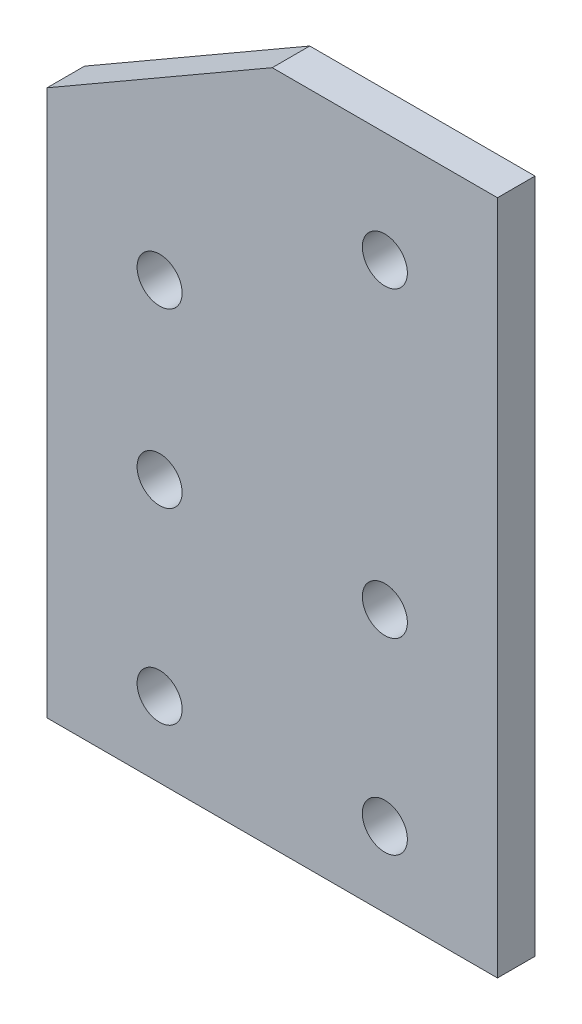
ISO-10303-21;
HEADER;
FILE_DESCRIPTION(('STEP AP214'),'2;1');
FILE_NAME('part.step','',(''),(''),'','','');
FILE_SCHEMA(('AUTOMOTIVE_DESIGN { 1 0 10303 214 1 1 1 1 }'));
ENDSEC;
DATA;
#1=APPLICATION_CONTEXT('core data for automotive mechanical design processes');
#2=APPLICATION_PROTOCOL_DEFINITION('international standard','automotive_design',2000,#1);
#3=PRODUCT_CONTEXT('',#1,'mechanical');
#4=PRODUCT('Part','Part','',(#3));
#5=PRODUCT_RELATED_PRODUCT_CATEGORY('part','',(#4));
#6=PRODUCT_DEFINITION_FORMATION('','',#4);
#7=PRODUCT_DEFINITION_CONTEXT('part definition',#1,'design');
#8=PRODUCT_DEFINITION('design','',#6,#7);
#9=PRODUCT_DEFINITION_SHAPE('','',#8);
#10=(LENGTH_UNIT() NAMED_UNIT(*) SI_UNIT(.MILLI.,.METRE.));
#11=(NAMED_UNIT(*) PLANE_ANGLE_UNIT() SI_UNIT($,.RADIAN.));
#12=(NAMED_UNIT(*) SI_UNIT($,.STERADIAN.) SOLID_ANGLE_UNIT());
#13=UNCERTAINTY_MEASURE_WITH_UNIT(LENGTH_MEASURE(1.E-05),#10,'distance_accuracy_value','');
#14=(GEOMETRIC_REPRESENTATION_CONTEXT(3) GLOBAL_UNCERTAINTY_ASSIGNED_CONTEXT((#13)) GLOBAL_UNIT_ASSIGNED_CONTEXT((#10,
#11,#12)) REPRESENTATION_CONTEXT('',''));
#15=CARTESIAN_POINT('',(0.,0.,0.));
#16=DIRECTION('',(0.,0.,1.));
#17=DIRECTION('',(1.,0.,0.));
#18=AXIS2_PLACEMENT_3D('',#15,#16,#17);
#19=CARTESIAN_POINT('',(0.,0.,6.35));
#20=DIRECTION('',(0.,0.,-1.));
#21=DIRECTION('',(-1.,0.,0.));
#22=AXIS2_PLACEMENT_3D('',#19,#20,#21);
#23=PLANE('',#22);
#24=DIRECTION('',(0.,-1.,0.));
#25=VECTOR('',#24,1.);
#26=CARTESIAN_POINT('',(0.,0.,6.35));
#27=LINE('',#26,#25);
#28=CARTESIAN_POINT('',(0.,92.3029547438752,6.35));
#29=VERTEX_POINT('',#28);
#30=CARTESIAN_POINT('',(0.,0.,6.35));
#31=VERTEX_POINT('',#30);
#32=EDGE_CURVE('E147',#29,#31,#27,.T.);
#33=ORIENTED_EDGE('',*,*,#32,.T.);
#34=DIRECTION('',(1.,0.,0.));
#35=VECTOR('',#34,1.);
#36=CARTESIAN_POINT('',(0.,0.,6.35));
#37=LINE('',#36,#35);
#38=CARTESIAN_POINT('',(76.2,0.,6.35));
#39=VERTEX_POINT('',#38);
#40=EDGE_CURVE('E104',#31,#39,#37,.T.);
#41=ORIENTED_EDGE('',*,*,#40,.T.);
#42=DIRECTION('',(0.,1.,0.));
#43=VECTOR('',#42,1.);
#44=CARTESIAN_POINT('',(76.2,0.,6.35));
#45=LINE('',#44,#43);
#46=CARTESIAN_POINT('',(76.2,114.3,6.35));
#47=VERTEX_POINT('',#46);
#48=EDGE_CURVE('E108',#39,#47,#45,.T.);
#49=ORIENTED_EDGE('',*,*,#48,.T.);
#50=DIRECTION('',(-1.,0.,0.));
#51=VECTOR('',#50,1.);
#52=CARTESIAN_POINT('',(38.1,114.3,6.35));
#53=LINE('',#52,#51);
#54=CARTESIAN_POINT('',(38.1,114.3,6.35));
#55=VERTEX_POINT('',#54);
#56=EDGE_CURVE('E112',#47,#55,#53,.T.);
#57=ORIENTED_EDGE('',*,*,#56,.T.);
#58=DIRECTION('',(-0.866025403784438,-0.500000000000001,0.));
#59=VECTOR('',#58,1.);
#60=CARTESIAN_POINT('',(0.,92.3029547438752,6.35));
#61=LINE('',#60,#59);
#62=EDGE_CURVE('E70',#55,#29,#61,.T.);
#63=ORIENTED_EDGE('',*,*,#62,.T.);
#64=EDGE_LOOP('',(#33,#41,#49,#57,#63));
#65=FACE_BOUND('',#64,.T.);
#66=CARTESIAN_POINT('',(57.15,95.6570452561244,6.35));
#67=DIRECTION('',(0.,0.,1.));
#68=DIRECTION('',(1.,0.,0.));
#69=AXIS2_PLACEMENT_3D('',#66,#67,#68);
#70=CIRCLE('',#69,3.81);
#71=CARTESIAN_POINT('',(60.96,95.6570452561244,6.35));
#72=VERTEX_POINT('',#71);
#73=EDGE_CURVE('E138',#72,#72,#70,.T.);
#74=ORIENTED_EDGE('',*,*,#73,.F.);
#75=EDGE_LOOP('',(#74));
#76=FACE_BOUND('',#75,.T.);
#77=CARTESIAN_POINT('',(19.05,73.66,6.35));
#78=DIRECTION('',(0.,0.,1.));
#79=DIRECTION('',(1.,0.,0.));
#80=AXIS2_PLACEMENT_3D('',#77,#78,#79);
#81=CIRCLE('',#80,3.81);
#82=CARTESIAN_POINT('',(22.86,73.66,6.35));
#83=VERTEX_POINT('',#82);
#84=EDGE_CURVE('E239',#83,#83,#81,.T.);
#85=ORIENTED_EDGE('',*,*,#84,.F.);
#86=EDGE_LOOP('',(#85));
#87=FACE_BOUND('',#86,.T.);
#88=CARTESIAN_POINT('',(19.05,44.45,6.35));
#89=DIRECTION('',(0.,0.,1.));
#90=DIRECTION('',(1.,0.,0.));
#91=AXIS2_PLACEMENT_3D('',#88,#89,#90);
#92=CIRCLE('',#91,3.81);
#93=CARTESIAN_POINT('',(22.86,44.45,6.35));
#94=VERTEX_POINT('',#93);
#95=EDGE_CURVE('E231',#94,#94,#92,.T.);
#96=ORIENTED_EDGE('',*,*,#95,.F.);
#97=EDGE_LOOP('',(#96));
#98=FACE_BOUND('',#97,.T.);
#99=CARTESIAN_POINT('',(19.05,12.7,6.35));
#100=DIRECTION('',(0.,0.,1.));
#101=DIRECTION('',(1.,0.,0.));
#102=AXIS2_PLACEMENT_3D('',#99,#100,#101);
#103=CIRCLE('',#102,3.81);
#104=CARTESIAN_POINT('',(22.86,12.7,6.35));
#105=VERTEX_POINT('',#104);
#106=EDGE_CURVE('E223',#105,#105,#103,.T.);
#107=ORIENTED_EDGE('',*,*,#106,.F.);
#108=EDGE_LOOP('',(#107));
#109=FACE_BOUND('',#108,.T.);
#110=CARTESIAN_POINT('',(57.15,44.45,6.35));
#111=DIRECTION('',(0.,0.,1.));
#112=DIRECTION('',(1.,0.,0.));
#113=AXIS2_PLACEMENT_3D('',#110,#111,#112);
#114=CIRCLE('',#113,3.81);
#115=CARTESIAN_POINT('',(60.96,44.45,6.35));
#116=VERTEX_POINT('',#115);
#117=EDGE_CURVE('E215',#116,#116,#114,.T.);
#118=ORIENTED_EDGE('',*,*,#117,.F.);
#119=EDGE_LOOP('',(#118));
#120=FACE_BOUND('',#119,.T.);
#121=CARTESIAN_POINT('',(57.15,12.7,6.35));
#122=DIRECTION('',(0.,0.,1.));
#123=DIRECTION('',(1.,0.,0.));
#124=AXIS2_PLACEMENT_3D('',#121,#122,#123);
#125=CIRCLE('',#124,3.81);
#126=CARTESIAN_POINT('',(60.96,12.7,6.35));
#127=VERTEX_POINT('',#126);
#128=EDGE_CURVE('E203',#127,#127,#125,.T.);
#129=ORIENTED_EDGE('',*,*,#128,.F.);
#130=EDGE_LOOP('',(#129));
#131=FACE_BOUND('',#130,.T.);
#132=ADVANCED_FACE('F52',(#65,#76,#87,#98,#109,#120,#131),#23,.F.);
#133=CARTESIAN_POINT('',(0.,0.,0.));
#134=DIRECTION('',(0.,0.,-1.));
#135=DIRECTION('',(-1.,0.,0.));
#136=AXIS2_PLACEMENT_3D('',#133,#134,#135);
#137=PLANE('',#136);
#138=CARTESIAN_POINT('',(57.15,44.45,0.));
#139=DIRECTION('',(0.,0.,1.));
#140=DIRECTION('',(1.,0.,0.));
#141=AXIS2_PLACEMENT_3D('',#138,#139,#140);
#142=CIRCLE('',#141,3.81);
#143=CARTESIAN_POINT('',(60.96,44.45,0.));
#144=VERTEX_POINT('',#143);
#145=EDGE_CURVE('E212',#144,#144,#142,.T.);
#146=ORIENTED_EDGE('',*,*,#145,.T.);
#147=EDGE_LOOP('',(#146));
#148=FACE_BOUND('',#147,.T.);
#149=CARTESIAN_POINT('',(19.05,44.45,0.));
#150=DIRECTION('',(0.,0.,1.));
#151=DIRECTION('',(1.,0.,0.));
#152=AXIS2_PLACEMENT_3D('',#149,#150,#151);
#153=CIRCLE('',#152,3.81);
#154=CARTESIAN_POINT('',(22.86,44.45,0.));
#155=VERTEX_POINT('',#154);
#156=EDGE_CURVE('E227',#155,#155,#153,.T.);
#157=ORIENTED_EDGE('',*,*,#156,.T.);
#158=EDGE_LOOP('',(#157));
#159=FACE_BOUND('',#158,.T.);
#160=CARTESIAN_POINT('',(57.15,95.6570452561244,0.));
#161=DIRECTION('',(0.,0.,1.));
#162=DIRECTION('',(1.,0.,0.));
#163=AXIS2_PLACEMENT_3D('',#160,#161,#162);
#164=CIRCLE('',#163,3.81);
#165=CARTESIAN_POINT('',(60.96,95.6570452561244,0.));
#166=VERTEX_POINT('',#165);
#167=EDGE_CURVE('E243',#166,#166,#164,.T.);
#168=ORIENTED_EDGE('',*,*,#167,.T.);
#169=EDGE_LOOP('',(#168));
#170=FACE_BOUND('',#169,.T.);
#171=DIRECTION('',(0.,-1.,0.));
#172=VECTOR('',#171,1.);
#173=CARTESIAN_POINT('',(0.,0.,0.));
#174=LINE('',#173,#172);
#175=CARTESIAN_POINT('',(0.,92.3029547438752,0.));
#176=VERTEX_POINT('',#175);
#177=CARTESIAN_POINT('',(0.,0.,0.));
#178=VERTEX_POINT('',#177);
#179=EDGE_CURVE('E133',#176,#178,#174,.T.);
#180=ORIENTED_EDGE('',*,*,#179,.F.);
#181=DIRECTION('',(-0.866025403784438,-0.500000000000001,0.));
#182=VECTOR('',#181,1.);
#183=CARTESIAN_POINT('',(0.,92.3029547438752,0.));
#184=LINE('',#183,#182);
#185=CARTESIAN_POINT('',(38.1,114.3,0.));
#186=VERTEX_POINT('',#185);
#187=EDGE_CURVE('E96',#186,#176,#184,.T.);
#188=ORIENTED_EDGE('',*,*,#187,.F.);
#189=DIRECTION('',(-1.,0.,0.));
#190=VECTOR('',#189,1.);
#191=CARTESIAN_POINT('',(38.1,114.3,0.));
#192=LINE('',#191,#190);
#193=CARTESIAN_POINT('',(76.2,114.3,0.));
#194=VERTEX_POINT('',#193);
#195=EDGE_CURVE('E90',#194,#186,#192,.T.);
#196=ORIENTED_EDGE('',*,*,#195,.F.);
#197=DIRECTION('',(0.,1.,0.));
#198=VECTOR('',#197,1.);
#199=CARTESIAN_POINT('',(76.2,0.,0.));
#200=LINE('',#199,#198);
#201=CARTESIAN_POINT('',(76.2,0.,0.));
#202=VERTEX_POINT('',#201);
#203=EDGE_CURVE('E120',#202,#194,#200,.T.);
#204=ORIENTED_EDGE('',*,*,#203,.F.);
#205=DIRECTION('',(1.,0.,0.));
#206=VECTOR('',#205,1.);
#207=CARTESIAN_POINT('',(0.,0.,0.));
#208=LINE('',#207,#206);
#209=EDGE_CURVE('E137',#178,#202,#208,.T.);
#210=ORIENTED_EDGE('',*,*,#209,.F.);
#211=EDGE_LOOP('',(#180,#188,#196,#204,#210));
#212=FACE_BOUND('',#211,.T.);
#213=CARTESIAN_POINT('',(19.05,73.66,0.));
#214=DIRECTION('',(0.,0.,1.));
#215=DIRECTION('',(1.,0.,0.));
#216=AXIS2_PLACEMENT_3D('',#213,#214,#215);
#217=CIRCLE('',#216,3.81);
#218=CARTESIAN_POINT('',(22.86,73.66,0.));
#219=VERTEX_POINT('',#218);
#220=EDGE_CURVE('E235',#219,#219,#217,.T.);
#221=ORIENTED_EDGE('',*,*,#220,.T.);
#222=EDGE_LOOP('',(#221));
#223=FACE_BOUND('',#222,.T.);
#224=CARTESIAN_POINT('',(19.05,12.7,0.));
#225=DIRECTION('',(0.,0.,1.));
#226=DIRECTION('',(1.,0.,0.));
#227=AXIS2_PLACEMENT_3D('',#224,#225,#226);
#228=CIRCLE('',#227,3.81);
#229=CARTESIAN_POINT('',(22.86,12.7,0.));
#230=VERTEX_POINT('',#229);
#231=EDGE_CURVE('E219',#230,#230,#228,.T.);
#232=ORIENTED_EDGE('',*,*,#231,.T.);
#233=EDGE_LOOP('',(#232));
#234=FACE_BOUND('',#233,.T.);
#235=CARTESIAN_POINT('',(57.15,12.7,0.));
#236=DIRECTION('',(0.,0.,1.));
#237=DIRECTION('',(1.,0.,0.));
#238=AXIS2_PLACEMENT_3D('',#235,#236,#237);
#239=CIRCLE('',#238,3.81);
#240=CARTESIAN_POINT('',(60.96,12.7,0.));
#241=VERTEX_POINT('',#240);
#242=EDGE_CURVE('E206',#241,#241,#239,.T.);
#243=ORIENTED_EDGE('',*,*,#242,.T.);
#244=EDGE_LOOP('',(#243));
#245=FACE_BOUND('',#244,.T.);
#246=ADVANCED_FACE('F155',(#148,#159,#170,#212,#223,#234,#245),#137,.T.);
#247=CARTESIAN_POINT('',(0.,0.,6.35));
#248=DIRECTION('',(1.,0.,0.));
#249=DIRECTION('',(0.,0.,-1.));
#250=AXIS2_PLACEMENT_3D('',#247,#248,#249);
#251=PLANE('',#250);
#252=ORIENTED_EDGE('',*,*,#179,.T.);
#253=DIRECTION('',(0.,0.,-1.));
#254=VECTOR('',#253,1.);
#255=CARTESIAN_POINT('',(0.,0.,6.35));
#256=LINE('',#255,#254);
#257=EDGE_CURVE('E13',#31,#178,#256,.T.);
#258=ORIENTED_EDGE('',*,*,#257,.F.);
#259=ORIENTED_EDGE('',*,*,#32,.F.);
#260=DIRECTION('',(0.,0.,-1.));
#261=VECTOR('',#260,1.);
#262=CARTESIAN_POINT('',(0.,92.3029547438752,6.35));
#263=LINE('',#262,#261);
#264=EDGE_CURVE('E129',#29,#176,#263,.T.);
#265=ORIENTED_EDGE('',*,*,#264,.T.);
#266=EDGE_LOOP('',(#252,#258,#259,#265));
#267=FACE_BOUND('',#266,.T.);
#268=ADVANCED_FACE('F54',(#267),#251,.F.);
#269=CARTESIAN_POINT('',(0.,0.,6.35));
#270=DIRECTION('',(0.,1.,0.));
#271=DIRECTION('',(0.,0.,1.));
#272=AXIS2_PLACEMENT_3D('',#269,#270,#271);
#273=PLANE('',#272);
#274=ORIENTED_EDGE('',*,*,#209,.T.);
#275=DIRECTION('',(0.,0.,-1.));
#276=VECTOR('',#275,1.);
#277=CARTESIAN_POINT('',(76.2,0.,6.35));
#278=LINE('',#277,#276);
#279=EDGE_CURVE('E62',#39,#202,#278,.T.);
#280=ORIENTED_EDGE('',*,*,#279,.F.);
#281=ORIENTED_EDGE('',*,*,#40,.F.);
#282=ORIENTED_EDGE('',*,*,#257,.T.);
#283=EDGE_LOOP('',(#274,#280,#281,#282));
#284=FACE_BOUND('',#283,.T.);
#285=ADVANCED_FACE('F336',(#284),#273,.F.);
#286=CARTESIAN_POINT('',(76.2,0.,6.35));
#287=DIRECTION('',(-1.,0.,0.));
#288=DIRECTION('',(0.,0.,1.));
#289=AXIS2_PLACEMENT_3D('',#286,#287,#288);
#290=PLANE('',#289);
#291=ORIENTED_EDGE('',*,*,#203,.T.);
#292=DIRECTION('',(0.,0.,-1.));
#293=VECTOR('',#292,1.);
#294=CARTESIAN_POINT('',(76.2,114.3,6.35));
#295=LINE('',#294,#293);
#296=EDGE_CURVE('E117',#47,#194,#295,.T.);
#297=ORIENTED_EDGE('',*,*,#296,.F.);
#298=ORIENTED_EDGE('',*,*,#48,.F.);
#299=ORIENTED_EDGE('',*,*,#279,.T.);
#300=EDGE_LOOP('',(#291,#297,#298,#299));
#301=FACE_BOUND('',#300,.T.);
#302=ADVANCED_FACE('F118',(#301),#290,.F.);
#303=CARTESIAN_POINT('',(38.1,114.3,6.35));
#304=DIRECTION('',(0.,-1.,0.));
#305=DIRECTION('',(1.,0.,0.));
#306=AXIS2_PLACEMENT_3D('',#303,#304,#305);
#307=PLANE('',#306);
#308=ORIENTED_EDGE('',*,*,#195,.T.);
#309=DIRECTION('',(0.,0.,-1.));
#310=VECTOR('',#309,1.);
#311=CARTESIAN_POINT('',(38.1,114.3,6.35));
#312=LINE('',#311,#310);
#313=EDGE_CURVE('E122',#55,#186,#312,.T.);
#314=ORIENTED_EDGE('',*,*,#313,.F.);
#315=ORIENTED_EDGE('',*,*,#56,.F.);
#316=ORIENTED_EDGE('',*,*,#296,.T.);
#317=EDGE_LOOP('',(#308,#314,#315,#316));
#318=FACE_BOUND('',#317,.T.);
#319=ADVANCED_FACE('F124',(#318),#307,.F.);
#320=CARTESIAN_POINT('',(0.,92.3029547438752,6.35));
#321=DIRECTION('',(0.500000000000001,-0.866025403784438,0.));
#322=DIRECTION('',(0.866025403784438,0.500000000000001,0.));
#323=AXIS2_PLACEMENT_3D('',#320,#321,#322);
#324=PLANE('',#323);
#325=ORIENTED_EDGE('',*,*,#187,.T.);
#326=ORIENTED_EDGE('',*,*,#264,.F.);
#327=ORIENTED_EDGE('',*,*,#62,.F.);
#328=ORIENTED_EDGE('',*,*,#313,.T.);
#329=EDGE_LOOP('',(#325,#326,#327,#328));
#330=FACE_BOUND('',#329,.T.);
#331=ADVANCED_FACE('F160',(#330),#324,.F.);
#332=CARTESIAN_POINT('',(57.15,95.6570452561244,6.35));
#333=DIRECTION('',(0.,0.,-1.));
#334=DIRECTION('',(-1.,0.,0.));
#335=AXIS2_PLACEMENT_3D('',#332,#333,#334);
#336=CYLINDRICAL_SURFACE('',#335,3.81);
#337=ORIENTED_EDGE('',*,*,#73,.T.);
#338=EDGE_LOOP('',(#337));
#339=FACE_BOUND('',#338,.T.);
#340=ORIENTED_EDGE('',*,*,#167,.F.);
#341=EDGE_LOOP('',(#340));
#342=FACE_BOUND('',#341,.T.);
#343=ADVANCED_FACE('F162',(#339,#342),#336,.F.);
#344=CARTESIAN_POINT('',(19.05,73.66,6.35));
#345=DIRECTION('',(0.,0.,-1.));
#346=DIRECTION('',(-1.,0.,0.));
#347=AXIS2_PLACEMENT_3D('',#344,#345,#346);
#348=CYLINDRICAL_SURFACE('',#347,3.81);
#349=ORIENTED_EDGE('',*,*,#84,.T.);
#350=EDGE_LOOP('',(#349));
#351=FACE_BOUND('',#350,.T.);
#352=ORIENTED_EDGE('',*,*,#220,.F.);
#353=EDGE_LOOP('',(#352));
#354=FACE_BOUND('',#353,.T.);
#355=ADVANCED_FACE('F168',(#351,#354),#348,.F.);
#356=CARTESIAN_POINT('',(19.05,44.45,6.35));
#357=DIRECTION('',(0.,0.,-1.));
#358=DIRECTION('',(-1.,0.,0.));
#359=AXIS2_PLACEMENT_3D('',#356,#357,#358);
#360=CYLINDRICAL_SURFACE('',#359,3.81);
#361=ORIENTED_EDGE('',*,*,#95,.T.);
#362=EDGE_LOOP('',(#361));
#363=FACE_BOUND('',#362,.T.);
#364=ORIENTED_EDGE('',*,*,#156,.F.);
#365=EDGE_LOOP('',(#364));
#366=FACE_BOUND('',#365,.T.);
#367=ADVANCED_FACE('F182',(#363,#366),#360,.F.);
#368=CARTESIAN_POINT('',(19.05,12.7,6.35));
#369=DIRECTION('',(0.,0.,-1.));
#370=DIRECTION('',(-1.,0.,0.));
#371=AXIS2_PLACEMENT_3D('',#368,#369,#370);
#372=CYLINDRICAL_SURFACE('',#371,3.81);
#373=ORIENTED_EDGE('',*,*,#106,.T.);
#374=EDGE_LOOP('',(#373));
#375=FACE_BOUND('',#374,.T.);
#376=ORIENTED_EDGE('',*,*,#231,.F.);
#377=EDGE_LOOP('',(#376));
#378=FACE_BOUND('',#377,.T.);
#379=ADVANCED_FACE('F186',(#375,#378),#372,.F.);
#380=CARTESIAN_POINT('',(57.15,44.45,6.35));
#381=DIRECTION('',(0.,0.,-1.));
#382=DIRECTION('',(-1.,0.,0.));
#383=AXIS2_PLACEMENT_3D('',#380,#381,#382);
#384=CYLINDRICAL_SURFACE('',#383,3.81);
#385=ORIENTED_EDGE('',*,*,#117,.T.);
#386=EDGE_LOOP('',(#385));
#387=FACE_BOUND('',#386,.T.);
#388=ORIENTED_EDGE('',*,*,#145,.F.);
#389=EDGE_LOOP('',(#388));
#390=FACE_BOUND('',#389,.T.);
#391=ADVANCED_FACE('F190',(#387,#390),#384,.F.);
#392=CARTESIAN_POINT('',(57.15,12.7,6.35));
#393=DIRECTION('',(0.,0.,-1.));
#394=DIRECTION('',(-1.,0.,0.));
#395=AXIS2_PLACEMENT_3D('',#392,#393,#394);
#396=CYLINDRICAL_SURFACE('',#395,3.81);
#397=ORIENTED_EDGE('',*,*,#128,.T.);
#398=EDGE_LOOP('',(#397));
#399=FACE_BOUND('',#398,.T.);
#400=ORIENTED_EDGE('',*,*,#242,.F.);
#401=EDGE_LOOP('',(#400));
#402=FACE_BOUND('',#401,.T.);
#403=ADVANCED_FACE('F194',(#399,#402),#396,.F.);
#404=CLOSED_SHELL('',(#132,#246,#268,#285,#302,#319,#331,#343,#355,#367,#379,#391,#403));
#405=MANIFOLD_SOLID_BREP('B2',#404);
#406=ADVANCED_BREP_SHAPE_REPRESENTATION('',(#18,#405),#14);
#407=SHAPE_DEFINITION_REPRESENTATION(#9,#406);
ENDSEC;
END-ISO-10303-21;
